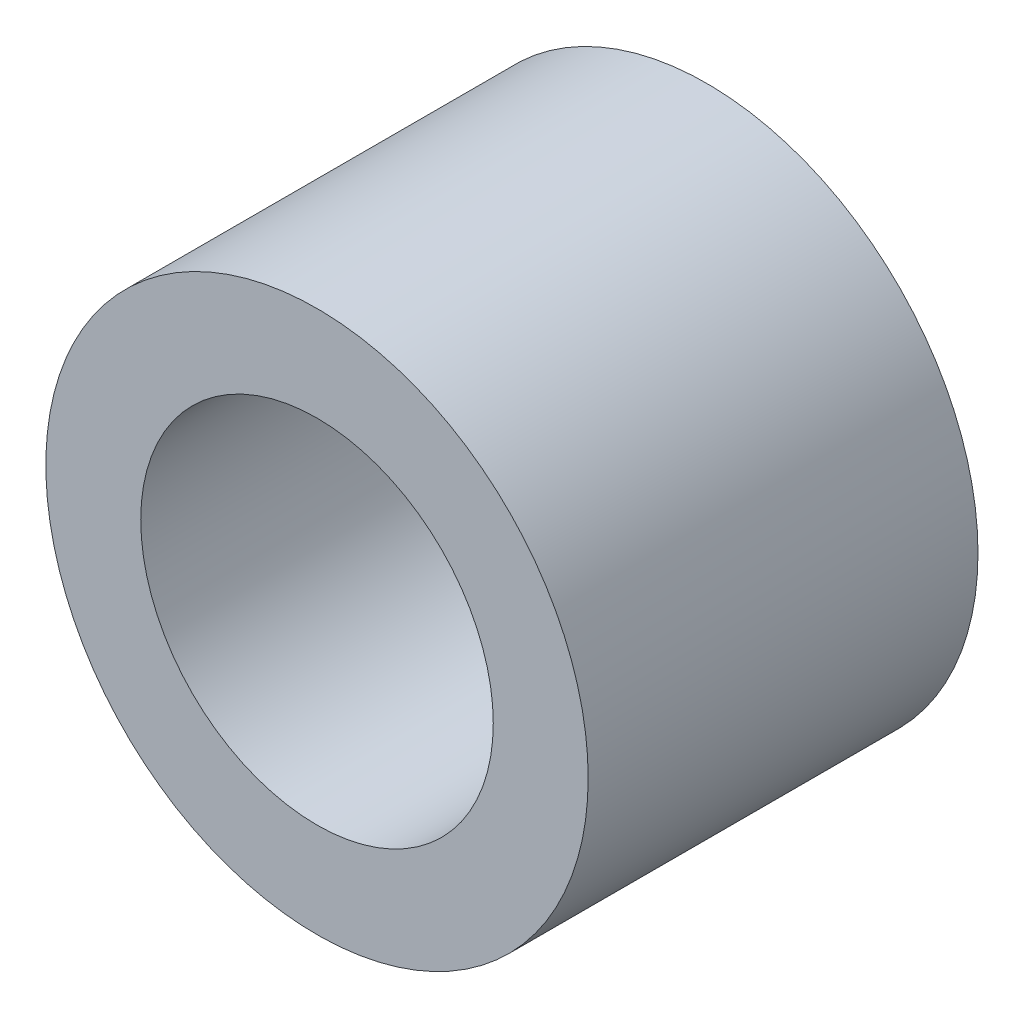
ISO-10303-21;
HEADER;
FILE_DESCRIPTION(('STEP AP214'),'2;1');
FILE_NAME('part.step','',(''),(''),'','','');
FILE_SCHEMA(('AUTOMOTIVE_DESIGN { 1 0 10303 214 1 1 1 1 }'));
ENDSEC;
DATA;
#1=APPLICATION_CONTEXT('core data for automotive mechanical design processes');
#2=APPLICATION_PROTOCOL_DEFINITION('international standard','automotive_design',2000,#1);
#3=PRODUCT_CONTEXT('',#1,'mechanical');
#4=PRODUCT('Part','Part','',(#3));
#5=PRODUCT_RELATED_PRODUCT_CATEGORY('part','',(#4));
#6=PRODUCT_DEFINITION_FORMATION('','',#4);
#7=PRODUCT_DEFINITION_CONTEXT('part definition',#1,'design');
#8=PRODUCT_DEFINITION('design','',#6,#7);
#9=PRODUCT_DEFINITION_SHAPE('','',#8);
#10=(LENGTH_UNIT() NAMED_UNIT(*) SI_UNIT(.MILLI.,.METRE.));
#11=(NAMED_UNIT(*) PLANE_ANGLE_UNIT() SI_UNIT($,.RADIAN.));
#12=(NAMED_UNIT(*) SI_UNIT($,.STERADIAN.) SOLID_ANGLE_UNIT());
#13=UNCERTAINTY_MEASURE_WITH_UNIT(LENGTH_MEASURE(1.E-05),#10,'distance_accuracy_value','');
#14=(GEOMETRIC_REPRESENTATION_CONTEXT(3) GLOBAL_UNCERTAINTY_ASSIGNED_CONTEXT((#13)) GLOBAL_UNIT_ASSIGNED_CONTEXT((#10,
#11,#12)) REPRESENTATION_CONTEXT('',''));
#15=CARTESIAN_POINT('',(0.,0.,0.));
#16=DIRECTION('',(0.,0.,1.));
#17=DIRECTION('',(1.,0.,0.));
#18=AXIS2_PLACEMENT_3D('',#15,#16,#17);
#19=CARTESIAN_POINT('',(0.,0.,5.75));
#20=DIRECTION('',(0.,0.,1.));
#21=DIRECTION('',(1.,0.,0.));
#22=AXIS2_PLACEMENT_3D('',#19,#20,#21);
#23=PLANE('',#22);
#24=CARTESIAN_POINT('',(0.,0.,5.75));
#25=DIRECTION('',(0.,0.,1.));
#26=DIRECTION('',(1.,0.,0.));
#27=AXIS2_PLACEMENT_3D('',#24,#25,#26);
#28=CIRCLE('',#27,4.);
#29=CARTESIAN_POINT('',(4.,0.,5.75));
#30=VERTEX_POINT('',#29);
#31=EDGE_CURVE('E10',#30,#30,#28,.T.);
#32=ORIENTED_EDGE('',*,*,#31,.T.);
#33=EDGE_LOOP('',(#32));
#34=FACE_BOUND('',#33,.T.);
#35=CARTESIAN_POINT('',(0.,0.,5.75));
#36=DIRECTION('',(0.,0.,1.));
#37=DIRECTION('',(1.,0.,0.));
#38=AXIS2_PLACEMENT_3D('',#35,#36,#37);
#39=CIRCLE('',#38,2.6);
#40=CARTESIAN_POINT('',(2.6,0.,5.75));
#41=VERTEX_POINT('',#40);
#42=EDGE_CURVE('E44',#41,#41,#39,.T.);
#43=ORIENTED_EDGE('',*,*,#42,.F.);
#44=EDGE_LOOP('',(#43));
#45=FACE_BOUND('',#44,.T.);
#46=ADVANCED_FACE('F33',(#34,#45),#23,.T.);
#47=CARTESIAN_POINT('',(0.,0.,0.));
#48=DIRECTION('',(0.,0.,1.));
#49=DIRECTION('',(1.,0.,0.));
#50=AXIS2_PLACEMENT_3D('',#47,#48,#49);
#51=PLANE('',#50);
#52=CARTESIAN_POINT('',(0.,0.,0.));
#53=DIRECTION('',(0.,0.,1.));
#54=DIRECTION('',(1.,0.,0.));
#55=AXIS2_PLACEMENT_3D('',#52,#53,#54);
#56=CIRCLE('',#55,4.);
#57=CARTESIAN_POINT('',(4.,0.,0.));
#58=VERTEX_POINT('',#57);
#59=EDGE_CURVE('E37',#58,#58,#56,.T.);
#60=ORIENTED_EDGE('',*,*,#59,.F.);
#61=EDGE_LOOP('',(#60));
#62=FACE_BOUND('',#61,.T.);
#63=CARTESIAN_POINT('',(0.,0.,0.));
#64=DIRECTION('',(0.,0.,1.));
#65=DIRECTION('',(1.,0.,0.));
#66=AXIS2_PLACEMENT_3D('',#63,#64,#65);
#67=CIRCLE('',#66,2.6);
#68=CARTESIAN_POINT('',(2.6,0.,0.));
#69=VERTEX_POINT('',#68);
#70=EDGE_CURVE('E46',#69,#69,#67,.T.);
#71=ORIENTED_EDGE('',*,*,#70,.T.);
#72=EDGE_LOOP('',(#71));
#73=FACE_BOUND('',#72,.T.);
#74=ADVANCED_FACE('F56',(#62,#73),#51,.F.);
#75=CARTESIAN_POINT('',(0.,0.,5.75));
#76=DIRECTION('',(0.,0.,-1.));
#77=DIRECTION('',(-1.,0.,0.));
#78=AXIS2_PLACEMENT_3D('',#75,#76,#77);
#79=CYLINDRICAL_SURFACE('',#78,4.);
#80=ORIENTED_EDGE('',*,*,#31,.F.);
#81=EDGE_LOOP('',(#80));
#82=FACE_BOUND('',#81,.T.);
#83=ORIENTED_EDGE('',*,*,#59,.T.);
#84=EDGE_LOOP('',(#83));
#85=FACE_BOUND('',#84,.T.);
#86=ADVANCED_FACE('F35',(#82,#85),#79,.T.);
#87=CARTESIAN_POINT('',(0.,0.,5.75));
#88=DIRECTION('',(0.,0.,-1.));
#89=DIRECTION('',(-1.,0.,0.));
#90=AXIS2_PLACEMENT_3D('',#87,#88,#89);
#91=CYLINDRICAL_SURFACE('',#90,2.6);
#92=ORIENTED_EDGE('',*,*,#42,.T.);
#93=EDGE_LOOP('',(#92));
#94=FACE_BOUND('',#93,.T.);
#95=ORIENTED_EDGE('',*,*,#70,.F.);
#96=EDGE_LOOP('',(#95));
#97=FACE_BOUND('',#96,.T.);
#98=ADVANCED_FACE('F52',(#94,#97),#91,.F.);
#99=CLOSED_SHELL('',(#46,#74,#86,#98));
#100=MANIFOLD_SOLID_BREP('B2',#99);
#101=ADVANCED_BREP_SHAPE_REPRESENTATION('',(#18,#100),#14);
#102=SHAPE_DEFINITION_REPRESENTATION(#9,#101);
ENDSEC;
END-ISO-10303-21;
